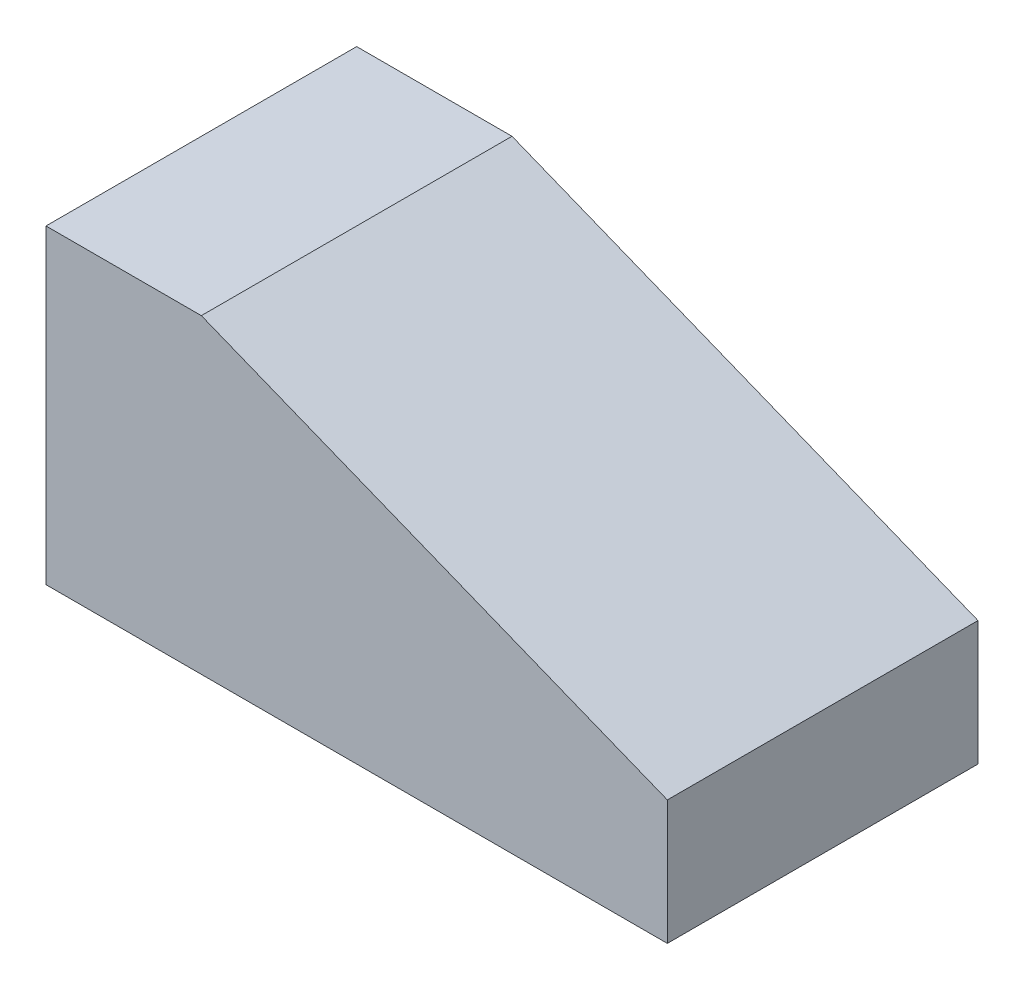
ISO-10303-21;
HEADER;
FILE_DESCRIPTION(('STEP AP214'),'2;1');
FILE_NAME('part.step','',(''),(''),'','','');
FILE_SCHEMA(('AUTOMOTIVE_DESIGN { 1 0 10303 214 1 1 1 1 }'));
ENDSEC;
DATA;
#1=APPLICATION_CONTEXT('core data for automotive mechanical design processes');
#2=APPLICATION_PROTOCOL_DEFINITION('international standard','automotive_design',2000,#1);
#3=PRODUCT_CONTEXT('',#1,'mechanical');
#4=PRODUCT('Part','Part','',(#3));
#5=PRODUCT_RELATED_PRODUCT_CATEGORY('part','',(#4));
#6=PRODUCT_DEFINITION_FORMATION('','',#4);
#7=PRODUCT_DEFINITION_CONTEXT('part definition',#1,'design');
#8=PRODUCT_DEFINITION('design','',#6,#7);
#9=PRODUCT_DEFINITION_SHAPE('','',#8);
#10=(LENGTH_UNIT() NAMED_UNIT(*) SI_UNIT(.MILLI.,.METRE.));
#11=(NAMED_UNIT(*) PLANE_ANGLE_UNIT() SI_UNIT($,.RADIAN.));
#12=(NAMED_UNIT(*) SI_UNIT($,.STERADIAN.) SOLID_ANGLE_UNIT());
#13=UNCERTAINTY_MEASURE_WITH_UNIT(LENGTH_MEASURE(1.E-05),#10,'distance_accuracy_value','');
#14=(GEOMETRIC_REPRESENTATION_CONTEXT(3) GLOBAL_UNCERTAINTY_ASSIGNED_CONTEXT((#13)) GLOBAL_UNIT_ASSIGNED_CONTEXT((#10,
#11,#12)) REPRESENTATION_CONTEXT('',''));
#15=CARTESIAN_POINT('',(0.,0.,0.));
#16=DIRECTION('',(0.,0.,1.));
#17=DIRECTION('',(1.,0.,0.));
#18=AXIS2_PLACEMENT_3D('',#15,#16,#17);
#19=CARTESIAN_POINT('',(100.,0.,50.));
#20=DIRECTION('',(0.,1.,0.));
#21=DIRECTION('',(-1.,0.,0.));
#22=AXIS2_PLACEMENT_3D('',#19,#20,#21);
#23=PLANE('',#22);
#24=DIRECTION('',(1.,0.,0.));
#25=VECTOR('',#24,1.);
#26=CARTESIAN_POINT('',(100.,0.,0.));
#27=LINE('',#26,#25);
#28=CARTESIAN_POINT('',(0.,0.,0.));
#29=VERTEX_POINT('',#28);
#30=CARTESIAN_POINT('',(100.,0.,0.));
#31=VERTEX_POINT('',#30);
#32=EDGE_CURVE('E118',#29,#31,#27,.T.);
#33=ORIENTED_EDGE('',*,*,#32,.T.);
#34=DIRECTION('',(0.,0.,-1.));
#35=VECTOR('',#34,1.);
#36=CARTESIAN_POINT('',(100.,0.,50.));
#37=LINE('',#36,#35);
#38=CARTESIAN_POINT('',(100.,0.,50.));
#39=VERTEX_POINT('',#38);
#40=EDGE_CURVE('E11',#39,#31,#37,.T.);
#41=ORIENTED_EDGE('',*,*,#40,.F.);
#42=DIRECTION('',(1.,0.,0.));
#43=VECTOR('',#42,1.);
#44=CARTESIAN_POINT('',(100.,0.,50.));
#45=LINE('',#44,#43);
#46=CARTESIAN_POINT('',(0.,0.,50.));
#47=VERTEX_POINT('',#46);
#48=EDGE_CURVE('E131',#47,#39,#45,.T.);
#49=ORIENTED_EDGE('',*,*,#48,.F.);
#50=DIRECTION('',(0.,0.,-1.));
#51=VECTOR('',#50,1.);
#52=CARTESIAN_POINT('',(0.,0.,50.));
#53=LINE('',#52,#51);
#54=EDGE_CURVE('E114',#47,#29,#53,.T.);
#55=ORIENTED_EDGE('',*,*,#54,.T.);
#56=EDGE_LOOP('',(#33,#41,#49,#55));
#57=FACE_BOUND('',#56,.T.);
#58=ADVANCED_FACE('F39',(#57),#23,.F.);
#59=CARTESIAN_POINT('',(100.,20.,50.));
#60=DIRECTION('',(-1.,0.,0.));
#61=DIRECTION('',(0.,0.,1.));
#62=AXIS2_PLACEMENT_3D('',#59,#60,#61);
#63=PLANE('',#62);
#64=DIRECTION('',(0.,1.,0.));
#65=VECTOR('',#64,1.);
#66=CARTESIAN_POINT('',(100.,20.,0.));
#67=LINE('',#66,#65);
#68=CARTESIAN_POINT('',(100.,20.,0.));
#69=VERTEX_POINT('',#68);
#70=EDGE_CURVE('E122',#31,#69,#67,.T.);
#71=ORIENTED_EDGE('',*,*,#70,.T.);
#72=DIRECTION('',(0.,0.,-1.));
#73=VECTOR('',#72,1.);
#74=CARTESIAN_POINT('',(100.,20.,50.));
#75=LINE('',#74,#73);
#76=CARTESIAN_POINT('',(100.,20.,50.));
#77=VERTEX_POINT('',#76);
#78=EDGE_CURVE('E48',#77,#69,#75,.T.);
#79=ORIENTED_EDGE('',*,*,#78,.F.);
#80=DIRECTION('',(0.,1.,0.));
#81=VECTOR('',#80,1.);
#82=CARTESIAN_POINT('',(100.,20.,50.));
#83=LINE('',#82,#81);
#84=EDGE_CURVE('E90',#39,#77,#83,.T.);
#85=ORIENTED_EDGE('',*,*,#84,.F.);
#86=ORIENTED_EDGE('',*,*,#40,.T.);
#87=EDGE_LOOP('',(#71,#79,#85,#86));
#88=FACE_BOUND('',#87,.T.);
#89=ADVANCED_FACE('F153',(#88),#63,.F.);
#90=CARTESIAN_POINT('',(25.,50.,50.));
#91=DIRECTION('',(-0.371390676354104,-0.928476690885259,0.));
#92=DIRECTION('',(0.928476690885259,-0.371390676354104,0.));
#93=AXIS2_PLACEMENT_3D('',#90,#91,#92);
#94=PLANE('',#93);
#95=DIRECTION('',(-0.928476690885259,0.371390676354104,0.));
#96=VECTOR('',#95,1.);
#97=CARTESIAN_POINT('',(25.,50.,0.));
#98=LINE('',#97,#96);
#99=CARTESIAN_POINT('',(25.,50.,0.));
#100=VERTEX_POINT('',#99);
#101=EDGE_CURVE('E106',#69,#100,#98,.T.);
#102=ORIENTED_EDGE('',*,*,#101,.T.);
#103=DIRECTION('',(0.,0.,-1.));
#104=VECTOR('',#103,1.);
#105=CARTESIAN_POINT('',(25.,50.,50.));
#106=LINE('',#105,#104);
#107=CARTESIAN_POINT('',(25.,50.,50.));
#108=VERTEX_POINT('',#107);
#109=EDGE_CURVE('E103',#108,#100,#106,.T.);
#110=ORIENTED_EDGE('',*,*,#109,.F.);
#111=DIRECTION('',(-0.928476690885259,0.371390676354104,0.));
#112=VECTOR('',#111,1.);
#113=CARTESIAN_POINT('',(25.,50.,50.));
#114=LINE('',#113,#112);
#115=EDGE_CURVE('E94',#77,#108,#114,.T.);
#116=ORIENTED_EDGE('',*,*,#115,.F.);
#117=ORIENTED_EDGE('',*,*,#78,.T.);
#118=EDGE_LOOP('',(#102,#110,#116,#117));
#119=FACE_BOUND('',#118,.T.);
#120=ADVANCED_FACE('F104',(#119),#94,.F.);
#121=CARTESIAN_POINT('',(0.,50.,50.));
#122=DIRECTION('',(0.,-1.,0.));
#123=DIRECTION('',(0.,0.,-1.));
#124=AXIS2_PLACEMENT_3D('',#121,#122,#123);
#125=PLANE('',#124);
#126=DIRECTION('',(-1.,0.,0.));
#127=VECTOR('',#126,1.);
#128=CARTESIAN_POINT('',(0.,50.,0.));
#129=LINE('',#128,#127);
#130=CARTESIAN_POINT('',(0.,50.,0.));
#131=VERTEX_POINT('',#130);
#132=EDGE_CURVE('E76',#100,#131,#129,.T.);
#133=ORIENTED_EDGE('',*,*,#132,.T.);
#134=DIRECTION('',(0.,0.,-1.));
#135=VECTOR('',#134,1.);
#136=CARTESIAN_POINT('',(0.,50.,50.));
#137=LINE('',#136,#135);
#138=CARTESIAN_POINT('',(0.,50.,50.));
#139=VERTEX_POINT('',#138);
#140=EDGE_CURVE('E108',#139,#131,#137,.T.);
#141=ORIENTED_EDGE('',*,*,#140,.F.);
#142=DIRECTION('',(-1.,0.,0.));
#143=VECTOR('',#142,1.);
#144=CARTESIAN_POINT('',(0.,50.,50.));
#145=LINE('',#144,#143);
#146=EDGE_CURVE('E98',#108,#139,#145,.T.);
#147=ORIENTED_EDGE('',*,*,#146,.F.);
#148=ORIENTED_EDGE('',*,*,#109,.T.);
#149=EDGE_LOOP('',(#133,#141,#147,#148));
#150=FACE_BOUND('',#149,.T.);
#151=ADVANCED_FACE('F110',(#150),#125,.F.);
#152=CARTESIAN_POINT('',(0.,0.,50.));
#153=DIRECTION('',(1.,0.,0.));
#154=DIRECTION('',(0.,0.,-1.));
#155=AXIS2_PLACEMENT_3D('',#152,#153,#154);
#156=PLANE('',#155);
#157=DIRECTION('',(0.,-1.,0.));
#158=VECTOR('',#157,1.);
#159=CARTESIAN_POINT('',(0.,0.,0.));
#160=LINE('',#159,#158);
#161=EDGE_CURVE('E82',#131,#29,#160,.T.);
#162=ORIENTED_EDGE('',*,*,#161,.T.);
#163=ORIENTED_EDGE('',*,*,#54,.F.);
#164=DIRECTION('',(0.,-1.,0.));
#165=VECTOR('',#164,1.);
#166=CARTESIAN_POINT('',(0.,0.,50.));
#167=LINE('',#166,#165);
#168=EDGE_CURVE('E56',#139,#47,#167,.T.);
#169=ORIENTED_EDGE('',*,*,#168,.F.);
#170=ORIENTED_EDGE('',*,*,#140,.T.);
#171=EDGE_LOOP('',(#162,#163,#169,#170));
#172=FACE_BOUND('',#171,.T.);
#173=ADVANCED_FACE('F142',(#172),#156,.F.);
#174=CARTESIAN_POINT('',(0.,0.,50.));
#175=DIRECTION('',(0.,0.,-1.));
#176=DIRECTION('',(-1.,0.,0.));
#177=AXIS2_PLACEMENT_3D('',#174,#175,#176);
#178=PLANE('',#177);
#179=ORIENTED_EDGE('',*,*,#48,.T.);
#180=ORIENTED_EDGE('',*,*,#84,.T.);
#181=ORIENTED_EDGE('',*,*,#115,.T.);
#182=ORIENTED_EDGE('',*,*,#146,.T.);
#183=ORIENTED_EDGE('',*,*,#168,.T.);
#184=EDGE_LOOP('',(#179,#180,#181,#182,#183));
#185=FACE_BOUND('',#184,.T.);
#186=ADVANCED_FACE('F96',(#185),#178,.F.);
#187=CARTESIAN_POINT('',(0.,0.,0.));
#188=DIRECTION('',(0.,0.,-1.));
#189=DIRECTION('',(-1.,0.,0.));
#190=AXIS2_PLACEMENT_3D('',#187,#188,#189);
#191=PLANE('',#190);
#192=ORIENTED_EDGE('',*,*,#32,.F.);
#193=ORIENTED_EDGE('',*,*,#161,.F.);
#194=ORIENTED_EDGE('',*,*,#132,.F.);
#195=ORIENTED_EDGE('',*,*,#101,.F.);
#196=ORIENTED_EDGE('',*,*,#70,.F.);
#197=EDGE_LOOP('',(#192,#193,#194,#195,#196));
#198=FACE_BOUND('',#197,.T.);
#199=ADVANCED_FACE('F138',(#198),#191,.T.);
#200=CLOSED_SHELL('',(#58,#89,#120,#151,#173,#186,#199));
#201=MANIFOLD_SOLID_BREP('B2',#200);
#202=ADVANCED_BREP_SHAPE_REPRESENTATION('',(#18,#201),#14);
#203=SHAPE_DEFINITION_REPRESENTATION(#9,#202);
ENDSEC;
END-ISO-10303-21;
